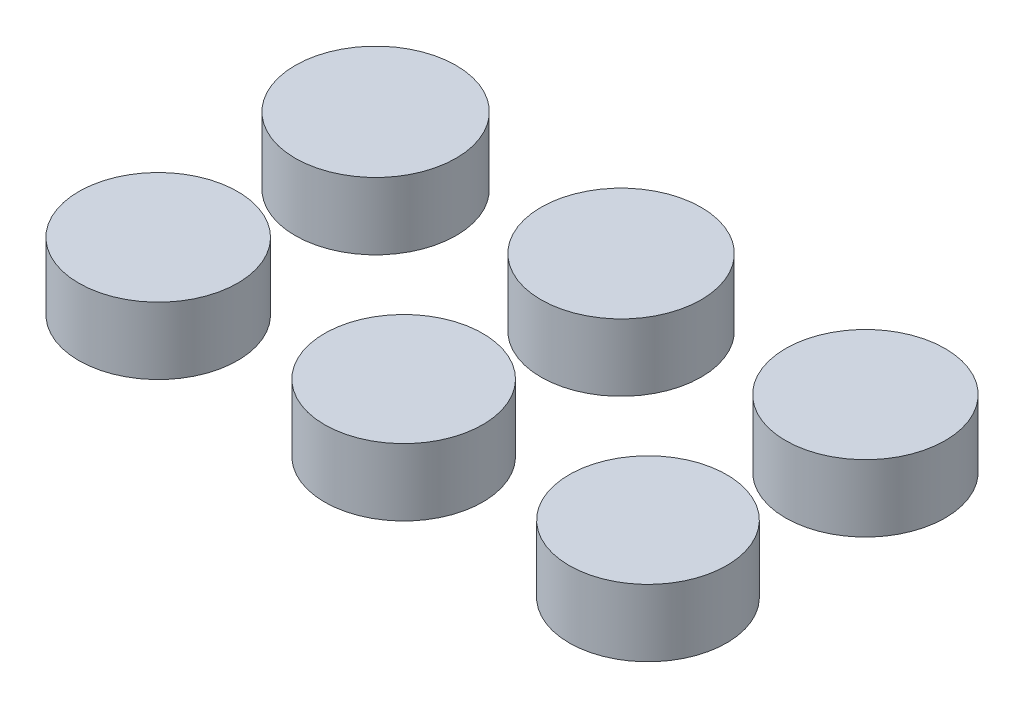
ISO-10303-21;
HEADER;
FILE_DESCRIPTION(('STEP AP214'),'2;1');
FILE_NAME('part.step','',(''),(''),'','','');
FILE_SCHEMA(('AUTOMOTIVE_DESIGN { 1 0 10303 214 1 1 1 1 }'));
ENDSEC;
DATA;
#1=APPLICATION_CONTEXT('core data for automotive mechanical design processes');
#2=APPLICATION_PROTOCOL_DEFINITION('international standard','automotive_design',2000,#1);
#3=PRODUCT_CONTEXT('',#1,'mechanical');
#4=PRODUCT('Part','Part','',(#3));
#5=PRODUCT_RELATED_PRODUCT_CATEGORY('part','',(#4));
#6=PRODUCT_DEFINITION_FORMATION('','',#4);
#7=PRODUCT_DEFINITION_CONTEXT('part definition',#1,'design');
#8=PRODUCT_DEFINITION('design','',#6,#7);
#9=PRODUCT_DEFINITION_SHAPE('','',#8);
#10=(LENGTH_UNIT() NAMED_UNIT(*) SI_UNIT(.MILLI.,.METRE.));
#11=(NAMED_UNIT(*) PLANE_ANGLE_UNIT() SI_UNIT($,.RADIAN.));
#12=(NAMED_UNIT(*) SI_UNIT($,.STERADIAN.) SOLID_ANGLE_UNIT());
#13=UNCERTAINTY_MEASURE_WITH_UNIT(LENGTH_MEASURE(1.E-05),#10,'distance_accuracy_value','');
#14=(GEOMETRIC_REPRESENTATION_CONTEXT(3) GLOBAL_UNCERTAINTY_ASSIGNED_CONTEXT((#13)) GLOBAL_UNIT_ASSIGNED_CONTEXT((#10,
#11,#12)) REPRESENTATION_CONTEXT('',''));
#15=CARTESIAN_POINT('',(0.,0.,0.));
#16=DIRECTION('',(0.,0.,1.));
#17=DIRECTION('',(1.,0.,0.));
#18=AXIS2_PLACEMENT_3D('',#15,#16,#17);
#19=CARTESIAN_POINT('',(0.,5.,16.2170093579336));
#20=DIRECTION('',(0.,-1.,0.));
#21=DIRECTION('',(0.,0.,-1.));
#22=AXIS2_PLACEMENT_3D('',#19,#20,#21);
#23=CYLINDRICAL_SURFACE('',#22,5.925);
#24=CARTESIAN_POINT('',(0.,5.,16.2170093579336));
#25=DIRECTION('',(0.,1.,0.));
#26=DIRECTION('',(0.,0.,1.));
#27=AXIS2_PLACEMENT_3D('',#24,#25,#26);
#28=CIRCLE('',#27,5.925);
#29=CARTESIAN_POINT('',(0.,5.,22.1420093579336));
#30=VERTEX_POINT('',#29);
#31=EDGE_CURVE('E56',#30,#30,#28,.T.);
#32=ORIENTED_EDGE('',*,*,#31,.F.);
#33=EDGE_LOOP('',(#32));
#34=FACE_BOUND('',#33,.T.);
#35=CARTESIAN_POINT('',(0.,0.,16.2170093579336));
#36=DIRECTION('',(0.,1.,0.));
#37=DIRECTION('',(0.,0.,1.));
#38=AXIS2_PLACEMENT_3D('',#35,#36,#37);
#39=CIRCLE('',#38,5.925);
#40=CARTESIAN_POINT('',(0.,0.,22.1420093579336));
#41=VERTEX_POINT('',#40);
#42=EDGE_CURVE('E11',#41,#41,#39,.T.);
#43=ORIENTED_EDGE('',*,*,#42,.T.);
#44=EDGE_LOOP('',(#43));
#45=FACE_BOUND('',#44,.T.);
#46=ADVANCED_FACE('F52',(#34,#45),#23,.T.);
#47=CARTESIAN_POINT('',(0.,5.,16.2170093579336));
#48=DIRECTION('',(0.,1.,0.));
#49=DIRECTION('',(0.,0.,1.));
#50=AXIS2_PLACEMENT_3D('',#47,#48,#49);
#51=PLANE('',#50);
#52=ORIENTED_EDGE('',*,*,#31,.T.);
#53=EDGE_LOOP('',(#52));
#54=FACE_BOUND('',#53,.T.);
#55=ADVANCED_FACE('F54',(#54),#51,.T.);
#56=CARTESIAN_POINT('',(0.,0.,16.2170093579336));
#57=DIRECTION('',(0.,1.,0.));
#58=DIRECTION('',(0.,0.,1.));
#59=AXIS2_PLACEMENT_3D('',#56,#57,#58);
#60=PLANE('',#59);
#61=ORIENTED_EDGE('',*,*,#42,.F.);
#62=EDGE_LOOP('',(#61));
#63=FACE_BOUND('',#62,.T.);
#64=ADVANCED_FACE('F71',(#63),#60,.F.);
#65=CLOSED_SHELL('',(#46,#55,#64));
#66=MANIFOLD_SOLID_BREP('B2',#65);
#67=CARTESIAN_POINT('',(18.3074512767529,5.,16.2170093579336));
#68=DIRECTION('',(0.,-1.,0.));
#69=DIRECTION('',(0.,0.,-1.));
#70=AXIS2_PLACEMENT_3D('',#67,#68,#69);
#71=CYLINDRICAL_SURFACE('',#70,5.9);
#72=CARTESIAN_POINT('',(18.3074512767529,5.,16.2170093579336));
#73=DIRECTION('',(0.,1.,0.));
#74=DIRECTION('',(0.,0.,1.));
#75=AXIS2_PLACEMENT_3D('',#72,#73,#74);
#76=CIRCLE('',#75,5.9);
#77=CARTESIAN_POINT('',(18.3074512767529,5.,22.1170093579336));
#78=VERTEX_POINT('',#77);
#79=EDGE_CURVE('E105',#78,#78,#76,.T.);
#80=ORIENTED_EDGE('',*,*,#79,.F.);
#81=EDGE_LOOP('',(#80));
#82=FACE_BOUND('',#81,.T.);
#83=CARTESIAN_POINT('',(18.3074512767529,0.,16.2170093579336));
#84=DIRECTION('',(0.,1.,0.));
#85=DIRECTION('',(0.,0.,1.));
#86=AXIS2_PLACEMENT_3D('',#83,#84,#85);
#87=CIRCLE('',#86,5.9);
#88=CARTESIAN_POINT('',(18.3074512767529,0.,22.1170093579336));
#89=VERTEX_POINT('',#88);
#90=EDGE_CURVE('E51',#89,#89,#87,.T.);
#91=ORIENTED_EDGE('',*,*,#90,.T.);
#92=EDGE_LOOP('',(#91));
#93=FACE_BOUND('',#92,.T.);
#94=ADVANCED_FACE('F101',(#82,#93),#71,.T.);
#95=CARTESIAN_POINT('',(18.3074512767529,5.,16.2170093579336));
#96=DIRECTION('',(0.,1.,0.));
#97=DIRECTION('',(0.,0.,1.));
#98=AXIS2_PLACEMENT_3D('',#95,#96,#97);
#99=PLANE('',#98);
#100=ORIENTED_EDGE('',*,*,#79,.T.);
#101=EDGE_LOOP('',(#100));
#102=FACE_BOUND('',#101,.T.);
#103=ADVANCED_FACE('F103',(#102),#99,.T.);
#104=CARTESIAN_POINT('',(18.3074512767529,0.,16.2170093579336));
#105=DIRECTION('',(0.,1.,0.));
#106=DIRECTION('',(0.,0.,1.));
#107=AXIS2_PLACEMENT_3D('',#104,#105,#106);
#108=PLANE('',#107);
#109=ORIENTED_EDGE('',*,*,#90,.F.);
#110=EDGE_LOOP('',(#109));
#111=FACE_BOUND('',#110,.T.);
#112=ADVANCED_FACE('F120',(#111),#108,.F.);
#113=CLOSED_SHELL('',(#94,#103,#112));
#114=MANIFOLD_SOLID_BREP('B6',#113);
#115=CARTESIAN_POINT('',(36.528983380074,5.,16.2170093579336));
#116=DIRECTION('',(0.,-1.,0.));
#117=DIRECTION('',(0.,0.,-1.));
#118=AXIS2_PLACEMENT_3D('',#115,#116,#117);
#119=CYLINDRICAL_SURFACE('',#118,5.875);
#120=CARTESIAN_POINT('',(36.528983380074,5.,16.2170093579336));
#121=DIRECTION('',(0.,1.,0.));
#122=DIRECTION('',(0.,0.,1.));
#123=AXIS2_PLACEMENT_3D('',#120,#121,#122);
#124=CIRCLE('',#123,5.875);
#125=CARTESIAN_POINT('',(36.528983380074,5.,22.0920093579336));
#126=VERTEX_POINT('',#125);
#127=EDGE_CURVE('E154',#126,#126,#124,.T.);
#128=ORIENTED_EDGE('',*,*,#127,.F.);
#129=EDGE_LOOP('',(#128));
#130=FACE_BOUND('',#129,.T.);
#131=CARTESIAN_POINT('',(36.528983380074,0.,16.2170093579336));
#132=DIRECTION('',(0.,1.,0.));
#133=DIRECTION('',(0.,0.,1.));
#134=AXIS2_PLACEMENT_3D('',#131,#132,#133);
#135=CIRCLE('',#134,5.875);
#136=CARTESIAN_POINT('',(36.528983380074,0.,22.0920093579336));
#137=VERTEX_POINT('',#136);
#138=EDGE_CURVE('E100',#137,#137,#135,.T.);
#139=ORIENTED_EDGE('',*,*,#138,.T.);
#140=EDGE_LOOP('',(#139));
#141=FACE_BOUND('',#140,.T.);
#142=ADVANCED_FACE('F150',(#130,#141),#119,.T.);
#143=CARTESIAN_POINT('',(36.528983380074,5.,16.2170093579336));
#144=DIRECTION('',(0.,1.,0.));
#145=DIRECTION('',(0.,0.,1.));
#146=AXIS2_PLACEMENT_3D('',#143,#144,#145);
#147=PLANE('',#146);
#148=ORIENTED_EDGE('',*,*,#127,.T.);
#149=EDGE_LOOP('',(#148));
#150=FACE_BOUND('',#149,.T.);
#151=ADVANCED_FACE('F152',(#150),#147,.T.);
#152=CARTESIAN_POINT('',(36.528983380074,0.,16.2170093579336));
#153=DIRECTION('',(0.,1.,0.));
#154=DIRECTION('',(0.,0.,1.));
#155=AXIS2_PLACEMENT_3D('',#152,#153,#154);
#156=PLANE('',#155);
#157=ORIENTED_EDGE('',*,*,#138,.F.);
#158=EDGE_LOOP('',(#157));
#159=FACE_BOUND('',#158,.T.);
#160=ADVANCED_FACE('F169',(#159),#156,.F.);
#161=CLOSED_SHELL('',(#142,#151,#160));
#162=MANIFOLD_SOLID_BREP('B46',#161);
#163=CARTESIAN_POINT('',(36.528983380074,5.,0.));
#164=DIRECTION('',(0.,-1.,0.));
#165=DIRECTION('',(0.,0.,-1.));
#166=AXIS2_PLACEMENT_3D('',#163,#164,#165);
#167=CYLINDRICAL_SURFACE('',#166,5.94999999999999);
#168=CARTESIAN_POINT('',(36.528983380074,5.,0.));
#169=DIRECTION('',(0.,1.,0.));
#170=DIRECTION('',(0.,0.,1.));
#171=AXIS2_PLACEMENT_3D('',#168,#169,#170);
#172=CIRCLE('',#171,5.94999999999999);
#173=CARTESIAN_POINT('',(36.528983380074,5.,5.94999999999999));
#174=VERTEX_POINT('',#173);
#175=EDGE_CURVE('E203',#174,#174,#172,.T.);
#176=ORIENTED_EDGE('',*,*,#175,.F.);
#177=EDGE_LOOP('',(#176));
#178=FACE_BOUND('',#177,.T.);
#179=CARTESIAN_POINT('',(36.528983380074,0.,0.));
#180=DIRECTION('',(0.,1.,0.));
#181=DIRECTION('',(0.,0.,1.));
#182=AXIS2_PLACEMENT_3D('',#179,#180,#181);
#183=CIRCLE('',#182,5.94999999999999);
#184=CARTESIAN_POINT('',(36.528983380074,0.,5.94999999999999));
#185=VERTEX_POINT('',#184);
#186=EDGE_CURVE('E149',#185,#185,#183,.T.);
#187=ORIENTED_EDGE('',*,*,#186,.T.);
#188=EDGE_LOOP('',(#187));
#189=FACE_BOUND('',#188,.T.);
#190=ADVANCED_FACE('F199',(#178,#189),#167,.T.);
#191=CARTESIAN_POINT('',(36.528983380074,5.,0.));
#192=DIRECTION('',(0.,1.,0.));
#193=DIRECTION('',(0.,0.,1.));
#194=AXIS2_PLACEMENT_3D('',#191,#192,#193);
#195=PLANE('',#194);
#196=ORIENTED_EDGE('',*,*,#175,.T.);
#197=EDGE_LOOP('',(#196));
#198=FACE_BOUND('',#197,.T.);
#199=ADVANCED_FACE('F201',(#198),#195,.T.);
#200=CARTESIAN_POINT('',(36.528983380074,0.,0.));
#201=DIRECTION('',(0.,1.,0.));
#202=DIRECTION('',(0.,0.,1.));
#203=AXIS2_PLACEMENT_3D('',#200,#201,#202);
#204=PLANE('',#203);
#205=ORIENTED_EDGE('',*,*,#186,.F.);
#206=EDGE_LOOP('',(#205));
#207=FACE_BOUND('',#206,.T.);
#208=ADVANCED_FACE('F218',(#207),#204,.F.);
#209=CLOSED_SHELL('',(#190,#199,#208));
#210=MANIFOLD_SOLID_BREP('B95',#209);
#211=CARTESIAN_POINT('',(18.3074512767529,5.,0.));
#212=DIRECTION('',(0.,-1.,0.));
#213=DIRECTION('',(0.,0.,-1.));
#214=AXIS2_PLACEMENT_3D('',#211,#212,#213);
#215=CYLINDRICAL_SURFACE('',#214,5.975);
#216=CARTESIAN_POINT('',(18.3074512767529,5.,0.));
#217=DIRECTION('',(0.,1.,0.));
#218=DIRECTION('',(0.,0.,1.));
#219=AXIS2_PLACEMENT_3D('',#216,#217,#218);
#220=CIRCLE('',#219,5.975);
#221=CARTESIAN_POINT('',(18.3074512767529,5.,5.975));
#222=VERTEX_POINT('',#221);
#223=EDGE_CURVE('E251',#222,#222,#220,.T.);
#224=ORIENTED_EDGE('',*,*,#223,.F.);
#225=EDGE_LOOP('',(#224));
#226=FACE_BOUND('',#225,.T.);
#227=CARTESIAN_POINT('',(18.3074512767529,0.,0.));
#228=DIRECTION('',(0.,1.,0.));
#229=DIRECTION('',(0.,0.,1.));
#230=AXIS2_PLACEMENT_3D('',#227,#228,#229);
#231=CIRCLE('',#230,5.975);
#232=CARTESIAN_POINT('',(18.3074512767529,0.,5.975));
#233=VERTEX_POINT('',#232);
#234=EDGE_CURVE('E198',#233,#233,#231,.T.);
#235=ORIENTED_EDGE('',*,*,#234,.T.);
#236=EDGE_LOOP('',(#235));
#237=FACE_BOUND('',#236,.T.);
#238=ADVANCED_FACE('F247',(#226,#237),#215,.T.);
#239=CARTESIAN_POINT('',(18.3074512767529,5.,0.));
#240=DIRECTION('',(0.,1.,0.));
#241=DIRECTION('',(0.,0.,1.));
#242=AXIS2_PLACEMENT_3D('',#239,#240,#241);
#243=PLANE('',#242);
#244=ORIENTED_EDGE('',*,*,#223,.T.);
#245=EDGE_LOOP('',(#244));
#246=FACE_BOUND('',#245,.T.);
#247=ADVANCED_FACE('F249',(#246),#243,.T.);
#248=CARTESIAN_POINT('',(18.3074512767529,0.,0.));
#249=DIRECTION('',(0.,1.,0.));
#250=DIRECTION('',(0.,0.,1.));
#251=AXIS2_PLACEMENT_3D('',#248,#249,#250);
#252=PLANE('',#251);
#253=ORIENTED_EDGE('',*,*,#234,.F.);
#254=EDGE_LOOP('',(#253));
#255=FACE_BOUND('',#254,.T.);
#256=ADVANCED_FACE('F266',(#255),#252,.F.);
#257=CLOSED_SHELL('',(#238,#247,#256));
#258=MANIFOLD_SOLID_BREP('B144',#257);
#259=CARTESIAN_POINT('',(0.,5.,0.));
#260=DIRECTION('',(0.,-1.,0.));
#261=DIRECTION('',(0.,0.,-1.));
#262=AXIS2_PLACEMENT_3D('',#259,#260,#261);
#263=CYLINDRICAL_SURFACE('',#262,6.);
#264=CARTESIAN_POINT('',(0.,5.,0.));
#265=DIRECTION('',(0.,1.,0.));
#266=DIRECTION('',(0.,0.,1.));
#267=AXIS2_PLACEMENT_3D('',#264,#265,#266);
#268=CIRCLE('',#267,6.);
#269=CARTESIAN_POINT('',(0.,5.,6.));
#270=VERTEX_POINT('',#269);
#271=EDGE_CURVE('E246',#270,#270,#268,.T.);
#272=ORIENTED_EDGE('',*,*,#271,.F.);
#273=EDGE_LOOP('',(#272));
#274=FACE_BOUND('',#273,.T.);
#275=CARTESIAN_POINT('',(0.,0.,0.));
#276=DIRECTION('',(0.,1.,0.));
#277=DIRECTION('',(0.,0.,1.));
#278=AXIS2_PLACEMENT_3D('',#275,#276,#277);
#279=CIRCLE('',#278,6.);
#280=CARTESIAN_POINT('',(0.,0.,6.));
#281=VERTEX_POINT('',#280);
#282=EDGE_CURVE('E291',#281,#281,#279,.T.);
#283=ORIENTED_EDGE('',*,*,#282,.T.);
#284=EDGE_LOOP('',(#283));
#285=FACE_BOUND('',#284,.T.);
#286=ADVANCED_FACE('F288',(#274,#285),#263,.T.);
#287=CARTESIAN_POINT('',(0.,5.,0.));
#288=DIRECTION('',(0.,1.,0.));
#289=DIRECTION('',(0.,0.,1.));
#290=AXIS2_PLACEMENT_3D('',#287,#288,#289);
#291=PLANE('',#290);
#292=ORIENTED_EDGE('',*,*,#271,.T.);
#293=EDGE_LOOP('',(#292));
#294=FACE_BOUND('',#293,.T.);
#295=ADVANCED_FACE('F305',(#294),#291,.T.);
#296=CARTESIAN_POINT('',(0.,0.,0.));
#297=DIRECTION('',(0.,1.,0.));
#298=DIRECTION('',(0.,0.,1.));
#299=AXIS2_PLACEMENT_3D('',#296,#297,#298);
#300=PLANE('',#299);
#301=ORIENTED_EDGE('',*,*,#282,.F.);
#302=EDGE_LOOP('',(#301));
#303=FACE_BOUND('',#302,.T.);
#304=ADVANCED_FACE('F303',(#303),#300,.F.);
#305=CLOSED_SHELL('',(#286,#295,#304));
#306=MANIFOLD_SOLID_BREP('B193',#305);
#307=ADVANCED_BREP_SHAPE_REPRESENTATION('',(#18,#66,#114,#162,#210,#258,#306),#14);
#308=SHAPE_DEFINITION_REPRESENTATION(#9,#307);
ENDSEC;
END-ISO-10303-21;
